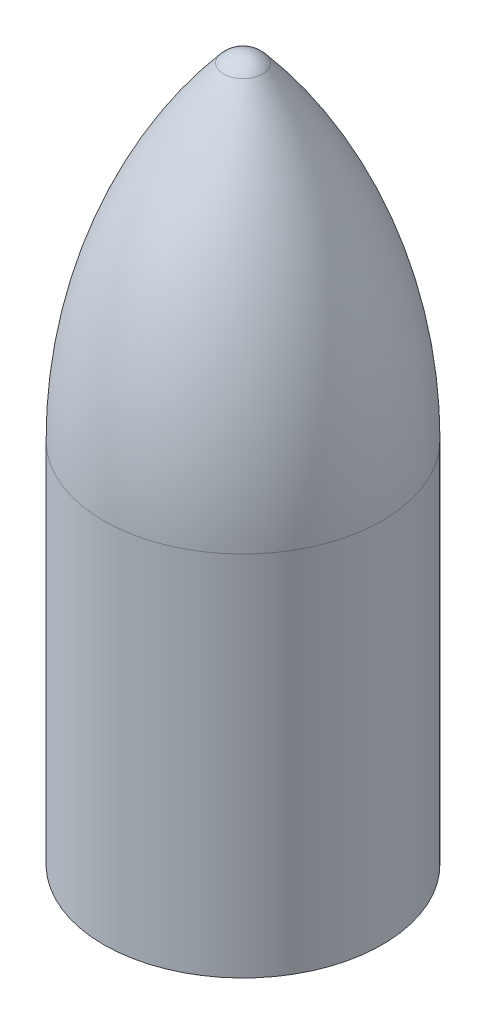
ISO-10303-21;
HEADER;
FILE_DESCRIPTION(('STEP AP214'),'2;1');
FILE_NAME('part.step','',(''),(''),'','','');
FILE_SCHEMA(('AUTOMOTIVE_DESIGN { 1 0 10303 214 1 1 1 1 }'));
ENDSEC;
DATA;
#1=APPLICATION_CONTEXT('core data for automotive mechanical design processes');
#2=APPLICATION_PROTOCOL_DEFINITION('international standard','automotive_design',2000,#1);
#3=PRODUCT_CONTEXT('',#1,'mechanical');
#4=PRODUCT('Part','Part','',(#3));
#5=PRODUCT_RELATED_PRODUCT_CATEGORY('part','',(#4));
#6=PRODUCT_DEFINITION_FORMATION('','',#4);
#7=PRODUCT_DEFINITION_CONTEXT('part definition',#1,'design');
#8=PRODUCT_DEFINITION('design','',#6,#7);
#9=PRODUCT_DEFINITION_SHAPE('','',#8);
#10=(LENGTH_UNIT() NAMED_UNIT(*) SI_UNIT(.MILLI.,.METRE.));
#11=(NAMED_UNIT(*) PLANE_ANGLE_UNIT() SI_UNIT($,.RADIAN.));
#12=(NAMED_UNIT(*) SI_UNIT($,.STERADIAN.) SOLID_ANGLE_UNIT());
#13=UNCERTAINTY_MEASURE_WITH_UNIT(LENGTH_MEASURE(1.E-05),#10,'distance_accuracy_value','');
#14=(GEOMETRIC_REPRESENTATION_CONTEXT(3) GLOBAL_UNCERTAINTY_ASSIGNED_CONTEXT((#13)) GLOBAL_UNIT_ASSIGNED_CONTEXT((#10,
#11,#12)) REPRESENTATION_CONTEXT('',''));
#15=CARTESIAN_POINT('',(0.,0.,0.));
#16=DIRECTION('',(0.,0.,1.));
#17=DIRECTION('',(1.,0.,0.));
#18=AXIS2_PLACEMENT_3D('',#15,#16,#17);
#19=CARTESIAN_POINT('',(-49.53,0.,0.));
#20=DIRECTION('',(0.,-1.,0.));
#21=DIRECTION('',(0.,0.,-1.));
#22=AXIS2_PLACEMENT_3D('',#19,#20,#21);
#23=PLANE('',#22);
#24=CARTESIAN_POINT('',(0.,0.,0.));
#25=DIRECTION('',(0.,-1.,0.));
#26=DIRECTION('',(0.,0.,-1.));
#27=AXIS2_PLACEMENT_3D('',#24,#25,#26);
#28=CIRCLE('',#27,46.99);
#29=CARTESIAN_POINT('',(0.,0.,-46.99));
#30=VERTEX_POINT('',#29);
#31=EDGE_CURVE('E54',#30,#30,#28,.F.);
#32=ORIENTED_EDGE('',*,*,#31,.T.);
#33=EDGE_LOOP('',(#32));
#34=FACE_BOUND('',#33,.T.);
#35=CARTESIAN_POINT('',(0.,0.,0.));
#36=DIRECTION('',(0.,1.,0.));
#37=DIRECTION('',(0.,0.,1.));
#38=AXIS2_PLACEMENT_3D('',#35,#36,#37);
#39=CIRCLE('',#38,49.53);
#40=CARTESIAN_POINT('',(0.,0.,49.53));
#41=VERTEX_POINT('',#40);
#42=EDGE_CURVE('E10',#41,#41,#39,.T.);
#43=ORIENTED_EDGE('',*,*,#42,.F.);
#44=EDGE_LOOP('',(#43));
#45=FACE_BOUND('',#44,.T.);
#46=ADVANCED_FACE('F37',(#34,#45),#23,.T.);
#47=CARTESIAN_POINT('',(0.,255.455794576252,0.));
#48=DIRECTION('',(0.,1.,0.));
#49=DIRECTION('',(0.,0.,1.));
#50=AXIS2_PLACEMENT_3D('',#47,#48,#49);
#51=CYLINDRICAL_SURFACE('',#50,49.53);
#52=ORIENTED_EDGE('',*,*,#42,.T.);
#53=EDGE_LOOP('',(#52));
#54=FACE_BOUND('',#53,.T.);
#55=CARTESIAN_POINT('',(0.,130.556,0.));
#56=DIRECTION('',(0.,1.,0.));
#57=DIRECTION('',(0.,0.,1.));
#58=AXIS2_PLACEMENT_3D('',#55,#56,#57);
#59=CIRCLE('',#58,49.53);
#60=CARTESIAN_POINT('',(0.,130.556,49.53));
#61=VERTEX_POINT('',#60);
#62=EDGE_CURVE('E44',#61,#61,#59,.T.);
#63=ORIENTED_EDGE('',*,*,#62,.F.);
#64=EDGE_LOOP('',(#63));
#65=FACE_BOUND('',#64,.T.);
#66=ADVANCED_FACE('F84',(#54,#65),#51,.T.);
#67=CARTESIAN_POINT('',(0.,130.556,0.));
#68=DIRECTION('',(0.,1.,0.));
#69=DIRECTION('',(0.,0.,1.));
#70=AXIS2_PLACEMENT_3D('',#67,#68,#69);
#71=DEGENERATE_TOROIDAL_SURFACE('',#70,130.284673714793,179.814673714793,.F.);
#72=ORIENTED_EDGE('',*,*,#62,.T.);
#73=EDGE_LOOP('',(#72));
#74=FACE_BOUND('',#73,.T.);
#75=CARTESIAN_POINT('',(0.,246.801643541067,0.));
#76=DIRECTION('',(0.,1.,0.));
#77=DIRECTION('',(0.,0.,1.));
#78=AXIS2_PLACEMENT_3D('',#75,#76,#77);
#79=CIRCLE('',#78,6.90230540815667);
#80=CARTESIAN_POINT('',(0.,246.801643541067,6.90230540815667));
#81=VERTEX_POINT('',#80);
#82=EDGE_CURVE('E49',#81,#81,#79,.T.);
#83=ORIENTED_EDGE('',*,*,#82,.F.);
#84=EDGE_LOOP('',(#83));
#85=FACE_BOUND('',#84,.T.);
#86=ADVANCED_FACE('F89',(#74,#85),#71,.F.);
#87=CARTESIAN_POINT('',(0.,240.952962134,0.));
#88=DIRECTION('',(0.,1.,0.));
#89=DIRECTION('',(-1.,0.,0.));
#90=AXIS2_PLACEMENT_3D('',#87,#88,#89);
#91=SPHERICAL_SURFACE('',#90,9.04703786600042);
#92=ORIENTED_EDGE('',*,*,#82,.T.);
#93=EDGE_LOOP('',(#92));
#94=FACE_BOUND('',#93,.T.);
#95=ADVANCED_FACE('F94',(#94),#91,.T.);
#96=CARTESIAN_POINT('',(0.,255.455794576252,0.));
#97=DIRECTION('',(0.,1.,0.));
#98=DIRECTION('',(0.,0.,1.));
#99=AXIS2_PLACEMENT_3D('',#96,#97,#98);
#100=CYLINDRICAL_SURFACE('',#99,46.99);
#101=ORIENTED_EDGE('',*,*,#31,.F.);
#102=EDGE_LOOP('',(#101));
#103=FACE_BOUND('',#102,.T.);
#104=CARTESIAN_POINT('',(0.,130.556,0.));
#105=DIRECTION('',(0.,1.,0.));
#106=DIRECTION('',(0.,0.,1.));
#107=AXIS2_PLACEMENT_3D('',#104,#105,#106);
#108=CIRCLE('',#107,46.99);
#109=CARTESIAN_POINT('',(0.,130.556,46.99));
#110=VERTEX_POINT('',#109);
#111=EDGE_CURVE('E60',#110,#110,#108,.T.);
#112=ORIENTED_EDGE('',*,*,#111,.T.);
#113=EDGE_LOOP('',(#112));
#114=FACE_BOUND('',#113,.T.);
#115=ADVANCED_FACE('F69',(#103,#114),#100,.F.);
#116=CARTESIAN_POINT('',(0.,130.556,0.));
#117=DIRECTION('',(0.,1.,0.));
#118=DIRECTION('',(0.,0.,1.));
#119=AXIS2_PLACEMENT_3D('',#116,#117,#118);
#120=DEGENERATE_TOROIDAL_SURFACE('',#119,130.284673714793,177.274673714793,.F.);
#121=ORIENTED_EDGE('',*,*,#111,.F.);
#122=EDGE_LOOP('',(#121));
#123=FACE_BOUND('',#122,.T.);
#124=CARTESIAN_POINT('',(0.,245.159597714136,0.));
#125=DIRECTION('',(0.,1.,0.));
#126=DIRECTION('',(0.,0.,1.));
#127=AXIS2_PLACEMENT_3D('',#124,#125,#126);
#128=CIRCLE('',#127,4.96444950477814);
#129=CARTESIAN_POINT('',(0.,245.159597714136,4.96444950477814));
#130=VERTEX_POINT('',#129);
#131=EDGE_CURVE('E61',#130,#130,#128,.T.);
#132=ORIENTED_EDGE('',*,*,#131,.T.);
#133=EDGE_LOOP('',(#132));
#134=FACE_BOUND('',#133,.T.);
#135=ADVANCED_FACE('F71',(#123,#134),#120,.T.);
#136=CARTESIAN_POINT('',(0.,240.952962134,0.));
#137=DIRECTION('',(0.,1.,0.));
#138=DIRECTION('',(-1.,0.,0.));
#139=AXIS2_PLACEMENT_3D('',#136,#137,#138);
#140=SPHERICAL_SURFACE('',#139,6.50703786600042);
#141=ORIENTED_EDGE('',*,*,#131,.F.);
#142=EDGE_LOOP('',(#141));
#143=FACE_BOUND('',#142,.T.);
#144=ADVANCED_FACE('F74',(#143),#140,.F.);
#145=CLOSED_SHELL('',(#46,#66,#86,#95,#115,#135,#144));
#146=MANIFOLD_SOLID_BREP('B2',#145);
#147=ADVANCED_BREP_SHAPE_REPRESENTATION('',(#18,#146),#14);
#148=SHAPE_DEFINITION_REPRESENTATION(#9,#147);
ENDSEC;
END-ISO-10303-21;
